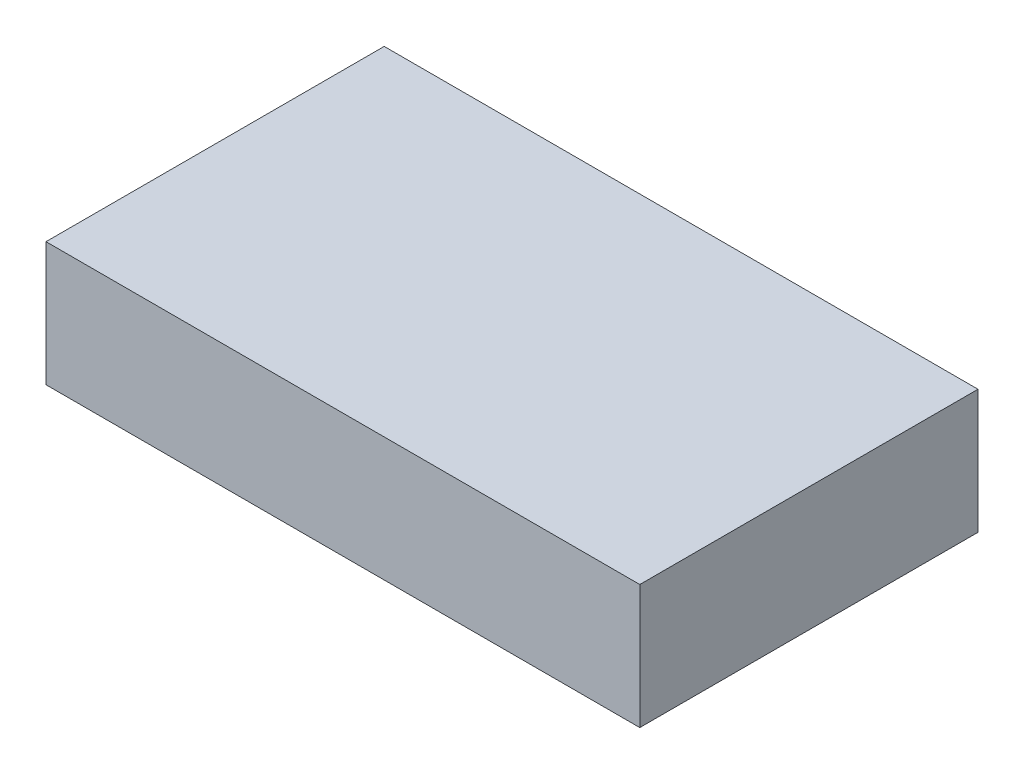
ISO-10303-21;
HEADER;
FILE_DESCRIPTION(('STEP AP214'),'2;1');
FILE_NAME('part.step','',(''),(''),'','','');
FILE_SCHEMA(('AUTOMOTIVE_DESIGN { 1 0 10303 214 1 1 1 1 }'));
ENDSEC;
DATA;
#1=APPLICATION_CONTEXT('core data for automotive mechanical design processes');
#2=APPLICATION_PROTOCOL_DEFINITION('international standard','automotive_design',2000,#1);
#3=PRODUCT_CONTEXT('',#1,'mechanical');
#4=PRODUCT('Part','Part','',(#3));
#5=PRODUCT_RELATED_PRODUCT_CATEGORY('part','',(#4));
#6=PRODUCT_DEFINITION_FORMATION('','',#4);
#7=PRODUCT_DEFINITION_CONTEXT('part definition',#1,'design');
#8=PRODUCT_DEFINITION('design','',#6,#7);
#9=PRODUCT_DEFINITION_SHAPE('','',#8);
#10=(LENGTH_UNIT() NAMED_UNIT(*) SI_UNIT(.MILLI.,.METRE.));
#11=(NAMED_UNIT(*) PLANE_ANGLE_UNIT() SI_UNIT($,.RADIAN.));
#12=(NAMED_UNIT(*) SI_UNIT($,.STERADIAN.) SOLID_ANGLE_UNIT());
#13=UNCERTAINTY_MEASURE_WITH_UNIT(LENGTH_MEASURE(1.E-05),#10,'distance_accuracy_value','');
#14=(GEOMETRIC_REPRESENTATION_CONTEXT(3) GLOBAL_UNCERTAINTY_ASSIGNED_CONTEXT((#13)) GLOBAL_UNIT_ASSIGNED_CONTEXT((#10,
#11,#12)) REPRESENTATION_CONTEXT('',''));
#15=CARTESIAN_POINT('',(0.,0.,0.));
#16=DIRECTION('',(0.,0.,1.));
#17=DIRECTION('',(1.,0.,0.));
#18=AXIS2_PLACEMENT_3D('',#15,#16,#17);
#19=CARTESIAN_POINT('',(57.5,24.,32.75));
#20=DIRECTION('',(-1.,0.,0.));
#21=DIRECTION('',(0.,0.,1.));
#22=AXIS2_PLACEMENT_3D('',#19,#20,#21);
#23=PLANE('',#22);
#24=DIRECTION('',(0.,0.,-1.));
#25=VECTOR('',#24,1.);
#26=CARTESIAN_POINT('',(57.5,0.,32.75));
#27=LINE('',#26,#25);
#28=CARTESIAN_POINT('',(57.5,0.,32.75));
#29=VERTEX_POINT('',#28);
#30=CARTESIAN_POINT('',(57.5,0.,-32.75));
#31=VERTEX_POINT('',#30);
#32=EDGE_CURVE('E96',#29,#31,#27,.T.);
#33=ORIENTED_EDGE('',*,*,#32,.T.);
#34=DIRECTION('',(0.,-1.,0.));
#35=VECTOR('',#34,1.);
#36=CARTESIAN_POINT('',(57.5,24.,-32.75));
#37=LINE('',#36,#35);
#38=CARTESIAN_POINT('',(57.5,24.,-32.75));
#39=VERTEX_POINT('',#38);
#40=EDGE_CURVE('E11',#39,#31,#37,.T.);
#41=ORIENTED_EDGE('',*,*,#40,.F.);
#42=DIRECTION('',(0.,0.,-1.));
#43=VECTOR('',#42,1.);
#44=CARTESIAN_POINT('',(57.5,24.,32.75));
#45=LINE('',#44,#43);
#46=CARTESIAN_POINT('',(57.5,24.,32.75));
#47=VERTEX_POINT('',#46);
#48=EDGE_CURVE('E84',#47,#39,#45,.T.);
#49=ORIENTED_EDGE('',*,*,#48,.F.);
#50=DIRECTION('',(0.,-1.,0.));
#51=VECTOR('',#50,1.);
#52=CARTESIAN_POINT('',(57.5,24.,32.75));
#53=LINE('',#52,#51);
#54=EDGE_CURVE('E92',#47,#29,#53,.T.);
#55=ORIENTED_EDGE('',*,*,#54,.T.);
#56=EDGE_LOOP('',(#33,#41,#49,#55));
#57=FACE_BOUND('',#56,.T.);
#58=ADVANCED_FACE('F33',(#57),#23,.F.);
#59=CARTESIAN_POINT('',(-57.5,24.,-32.75));
#60=DIRECTION('',(0.,0.,1.));
#61=DIRECTION('',(1.,0.,0.));
#62=AXIS2_PLACEMENT_3D('',#59,#60,#61);
#63=PLANE('',#62);
#64=DIRECTION('',(-1.,0.,0.));
#65=VECTOR('',#64,1.);
#66=CARTESIAN_POINT('',(-57.5,0.,-32.75));
#67=LINE('',#66,#65);
#68=CARTESIAN_POINT('',(-57.5,0.,-32.75));
#69=VERTEX_POINT('',#68);
#70=EDGE_CURVE('E88',#31,#69,#67,.T.);
#71=ORIENTED_EDGE('',*,*,#70,.T.);
#72=DIRECTION('',(0.,-1.,0.));
#73=VECTOR('',#72,1.);
#74=CARTESIAN_POINT('',(-57.5,24.,-32.75));
#75=LINE('',#74,#73);
#76=CARTESIAN_POINT('',(-57.5,24.,-32.75));
#77=VERTEX_POINT('',#76);
#78=EDGE_CURVE('E41',#77,#69,#75,.T.);
#79=ORIENTED_EDGE('',*,*,#78,.F.);
#80=DIRECTION('',(-1.,0.,0.));
#81=VECTOR('',#80,1.);
#82=CARTESIAN_POINT('',(-57.5,24.,-32.75));
#83=LINE('',#82,#81);
#84=EDGE_CURVE('E79',#39,#77,#83,.T.);
#85=ORIENTED_EDGE('',*,*,#84,.F.);
#86=ORIENTED_EDGE('',*,*,#40,.T.);
#87=EDGE_LOOP('',(#71,#79,#85,#86));
#88=FACE_BOUND('',#87,.T.);
#89=ADVANCED_FACE('F87',(#88),#63,.F.);
#90=CARTESIAN_POINT('',(-57.5,24.,32.75));
#91=DIRECTION('',(1.,0.,0.));
#92=DIRECTION('',(0.,0.,-1.));
#93=AXIS2_PLACEMENT_3D('',#90,#91,#92);
#94=PLANE('',#93);
#95=DIRECTION('',(0.,0.,1.));
#96=VECTOR('',#95,1.);
#97=CARTESIAN_POINT('',(-57.5,0.,32.75));
#98=LINE('',#97,#96);
#99=CARTESIAN_POINT('',(-57.5,0.,32.75));
#100=VERTEX_POINT('',#99);
#101=EDGE_CURVE('E66',#69,#100,#98,.T.);
#102=ORIENTED_EDGE('',*,*,#101,.T.);
#103=DIRECTION('',(0.,-1.,0.));
#104=VECTOR('',#103,1.);
#105=CARTESIAN_POINT('',(-57.5,24.,32.75));
#106=LINE('',#105,#104);
#107=CARTESIAN_POINT('',(-57.5,24.,32.75));
#108=VERTEX_POINT('',#107);
#109=EDGE_CURVE('E89',#108,#100,#106,.T.);
#110=ORIENTED_EDGE('',*,*,#109,.F.);
#111=DIRECTION('',(0.,0.,1.));
#112=VECTOR('',#111,1.);
#113=CARTESIAN_POINT('',(-57.5,24.,32.75));
#114=LINE('',#113,#112);
#115=EDGE_CURVE('E82',#77,#108,#114,.T.);
#116=ORIENTED_EDGE('',*,*,#115,.F.);
#117=ORIENTED_EDGE('',*,*,#78,.T.);
#118=EDGE_LOOP('',(#102,#110,#116,#117));
#119=FACE_BOUND('',#118,.T.);
#120=ADVANCED_FACE('F90',(#119),#94,.F.);
#121=CARTESIAN_POINT('',(-57.5,24.,32.75));
#122=DIRECTION('',(0.,0.,-1.));
#123=DIRECTION('',(-1.,0.,0.));
#124=AXIS2_PLACEMENT_3D('',#121,#122,#123);
#125=PLANE('',#124);
#126=DIRECTION('',(1.,0.,0.));
#127=VECTOR('',#126,1.);
#128=CARTESIAN_POINT('',(-57.5,0.,32.75));
#129=LINE('',#128,#127);
#130=EDGE_CURVE('E72',#100,#29,#129,.T.);
#131=ORIENTED_EDGE('',*,*,#130,.T.);
#132=ORIENTED_EDGE('',*,*,#54,.F.);
#133=DIRECTION('',(1.,0.,0.));
#134=VECTOR('',#133,1.);
#135=CARTESIAN_POINT('',(-57.5,24.,32.75));
#136=LINE('',#135,#134);
#137=EDGE_CURVE('E49',#108,#47,#136,.T.);
#138=ORIENTED_EDGE('',*,*,#137,.F.);
#139=ORIENTED_EDGE('',*,*,#109,.T.);
#140=EDGE_LOOP('',(#131,#132,#138,#139));
#141=FACE_BOUND('',#140,.T.);
#142=ADVANCED_FACE('F103',(#141),#125,.F.);
#143=CARTESIAN_POINT('',(0.,24.,0.));
#144=DIRECTION('',(0.,-1.,0.));
#145=DIRECTION('',(0.,0.,-1.));
#146=AXIS2_PLACEMENT_3D('',#143,#144,#145);
#147=PLANE('',#146);
#148=ORIENTED_EDGE('',*,*,#48,.T.);
#149=ORIENTED_EDGE('',*,*,#84,.T.);
#150=ORIENTED_EDGE('',*,*,#115,.T.);
#151=ORIENTED_EDGE('',*,*,#137,.T.);
#152=EDGE_LOOP('',(#148,#149,#150,#151));
#153=FACE_BOUND('',#152,.T.);
#154=ADVANCED_FACE('F80',(#153),#147,.F.);
#155=CARTESIAN_POINT('',(0.,0.,0.));
#156=DIRECTION('',(0.,-1.,0.));
#157=DIRECTION('',(0.,0.,-1.));
#158=AXIS2_PLACEMENT_3D('',#155,#156,#157);
#159=PLANE('',#158);
#160=ORIENTED_EDGE('',*,*,#32,.F.);
#161=ORIENTED_EDGE('',*,*,#130,.F.);
#162=ORIENTED_EDGE('',*,*,#101,.F.);
#163=ORIENTED_EDGE('',*,*,#70,.F.);
#164=EDGE_LOOP('',(#160,#161,#162,#163));
#165=FACE_BOUND('',#164,.T.);
#166=ADVANCED_FACE('F106',(#165),#159,.T.);
#167=CLOSED_SHELL('',(#58,#89,#120,#142,#154,#166));
#168=MANIFOLD_SOLID_BREP('B2',#167);
#169=ADVANCED_BREP_SHAPE_REPRESENTATION('',(#18,#168),#14);
#170=SHAPE_DEFINITION_REPRESENTATION(#9,#169);
ENDSEC;
END-ISO-10303-21;
